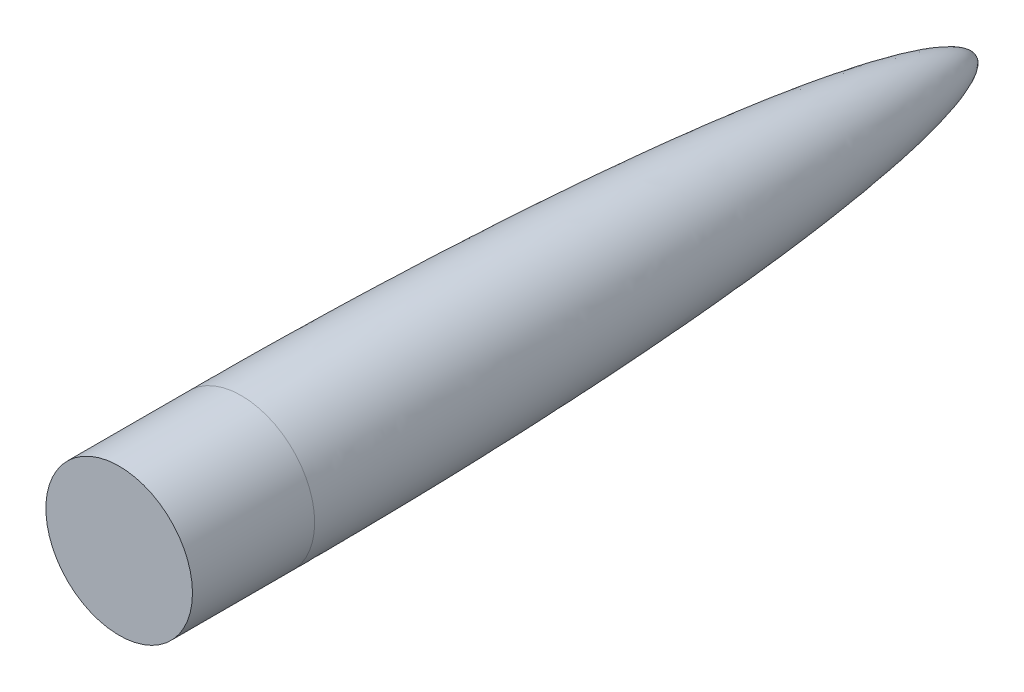
ISO-10303-21;
HEADER;
FILE_DESCRIPTION(('STEP AP214'),'2;1');
FILE_NAME('part.step','',(''),(''),'','','');
FILE_SCHEMA(('AUTOMOTIVE_DESIGN { 1 0 10303 214 1 1 1 1 }'));
ENDSEC;
DATA;
#1=APPLICATION_CONTEXT('core data for automotive mechanical design processes');
#2=APPLICATION_PROTOCOL_DEFINITION('international standard','automotive_design',2000,#1);
#3=PRODUCT_CONTEXT('',#1,'mechanical');
#4=PRODUCT('Part','Part','',(#3));
#5=PRODUCT_RELATED_PRODUCT_CATEGORY('part','',(#4));
#6=PRODUCT_DEFINITION_FORMATION('','',#4);
#7=PRODUCT_DEFINITION_CONTEXT('part definition',#1,'design');
#8=PRODUCT_DEFINITION('design','',#6,#7);
#9=PRODUCT_DEFINITION_SHAPE('','',#8);
#10=(LENGTH_UNIT() NAMED_UNIT(*) SI_UNIT(.MILLI.,.METRE.));
#11=(NAMED_UNIT(*) PLANE_ANGLE_UNIT() SI_UNIT($,.RADIAN.));
#12=(NAMED_UNIT(*) SI_UNIT($,.STERADIAN.) SOLID_ANGLE_UNIT());
#13=UNCERTAINTY_MEASURE_WITH_UNIT(LENGTH_MEASURE(1.E-05),#10,'distance_accuracy_value','');
#14=(GEOMETRIC_REPRESENTATION_CONTEXT(3) GLOBAL_UNCERTAINTY_ASSIGNED_CONTEXT((#13)) GLOBAL_UNIT_ASSIGNED_CONTEXT((#10,
#11,#12)) REPRESENTATION_CONTEXT('',''));
#15=CARTESIAN_POINT('',(0.,0.,0.));
#16=DIRECTION('',(0.,0.,1.));
#17=DIRECTION('',(1.,0.,0.));
#18=AXIS2_PLACEMENT_3D('',#15,#16,#17);
#19=CARTESIAN_POINT('',(0.,0.,127.));
#20=DIRECTION('',(0.,0.,-1.));
#21=DIRECTION('',(-1.,0.,0.));
#22=AXIS2_PLACEMENT_3D('',#19,#20,#21);
#23=CYLINDRICAL_SURFACE('',#22,76.2);
#24=CARTESIAN_POINT('',(0.,0.,127.));
#25=DIRECTION('',(0.,0.,1.));
#26=DIRECTION('',(1.,0.,0.));
#27=AXIS2_PLACEMENT_3D('',#24,#25,#26);
#28=CIRCLE('',#27,76.2);
#29=CARTESIAN_POINT('',(76.2,0.,127.));
#30=VERTEX_POINT('',#29);
#31=EDGE_CURVE('E11',#30,#30,#28,.T.);
#32=ORIENTED_EDGE('',*,*,#31,.F.);
#33=EDGE_LOOP('',(#32));
#34=FACE_BOUND('',#33,.T.);
#35=CARTESIAN_POINT('',(0.,0.,0.));
#36=DIRECTION('',(0.,0.,1.));
#37=DIRECTION('',(1.,0.,0.));
#38=AXIS2_PLACEMENT_3D('',#35,#36,#37);
#39=CIRCLE('',#38,76.2);
#40=CARTESIAN_POINT('',(76.2,0.,0.));
#41=VERTEX_POINT('',#40);
#42=EDGE_CURVE('E50',#41,#41,#39,.T.);
#43=ORIENTED_EDGE('',*,*,#42,.T.);
#44=EDGE_LOOP('',(#43));
#45=FACE_BOUND('',#44,.T.);
#46=ADVANCED_FACE('F39',(#34,#45),#23,.T.);
#47=CARTESIAN_POINT('',(0.,0.,127.));
#48=DIRECTION('',(0.,0.,1.));
#49=DIRECTION('',(1.,0.,0.));
#50=AXIS2_PLACEMENT_3D('',#47,#48,#49);
#51=PLANE('',#50);
#52=ORIENTED_EDGE('',*,*,#31,.T.);
#53=EDGE_LOOP('',(#52));
#54=FACE_BOUND('',#53,.T.);
#55=ADVANCED_FACE('F55',(#54),#51,.T.);
#56=CARTESIAN_POINT('',(0.,0.,-762.));
#57=CARTESIAN_POINT('',(0.,0.486576307109411,-761.999412940227));
#58=CARTESIAN_POINT('',(0.,1.14846036748612,-761.943391779038));
#59=CARTESIAN_POINT('',(0.,2.01477435115242,-761.767441531751));
#60=CARTESIAN_POINT('',(0.,3.14669217771254,-761.371516483082));
#61=CARTESIAN_POINT('',(0.,4.09594230811432,-760.927979401583));
#62=CARTESIAN_POINT('',(0.,5.20328694406654,-760.260109141381));
#63=CARTESIAN_POINT('',(0.,6.50167925000615,-759.271379797162));
#64=CARTESIAN_POINT('',(0.,8.03223258741555,-757.830468181328));
#65=CARTESIAN_POINT('',(0.,9.94012125767027,-755.60935351043));
#66=CARTESIAN_POINT('',(0.,12.4342727581284,-752.002079812972));
#67=CARTESIAN_POINT('',(0.,15.8394192474952,-745.772601329123));
#68=CARTESIAN_POINT('',(0.,19.4950240559308,-737.112527419109));
#69=CARTESIAN_POINT('',(0.,23.1564940016857,-726.400675577437));
#70=CARTESIAN_POINT('',(0.,26.5369810514891,-714.615330257593));
#71=CARTESIAN_POINT('',(0.,29.4224539407738,-703.156611322784));
#72=CARTESIAN_POINT('',(0.,32.5948137892384,-689.135822315339));
#73=CARTESIAN_POINT('',(0.,36.2991105751397,-670.645230154531));
#74=CARTESIAN_POINT('',(0.,40.3334212477934,-647.387926465431));
#75=CARTESIAN_POINT('',(0.,45.6278931859708,-611.862125806289));
#76=CARTESIAN_POINT('',(0.,51.1756333770142,-566.790800708857));
#77=CARTESIAN_POINT('',(0.,56.4893928108532,-514.079621006663));
#78=CARTESIAN_POINT('',(0.,61.4081542475398,-453.734719278005));
#79=CARTESIAN_POINT('',(0.,65.4219334448524,-393.324055345825));
#80=CARTESIAN_POINT('',(0.,68.2740910464225,-340.425271329381));
#81=CARTESIAN_POINT('',(0.,70.3105648451017,-295.064010425315));
#82=CARTESIAN_POINT('',(0.,71.6115838045062,-261.033679036971));
#83=CARTESIAN_POINT('',(0.,72.3892794678055,-238.343835210581));
#84=CARTESIAN_POINT('',(0.,72.9792224135485,-219.433291243113));
#85=CARTESIAN_POINT('',(0.,73.4170732137365,-204.304699792635));
#86=CARTESIAN_POINT('',(0.,73.821317355376,-189.17338818602));
#87=CARTESIAN_POINT('',(0.,74.192565633316,-174.044415613265));
#88=CARTESIAN_POINT('',(0.,74.5312596414046,-158.909284971795));
#89=CARTESIAN_POINT('',(0.,74.8378621623494,-143.782440946102));
#90=CARTESIAN_POINT('',(0.,75.1127438124663,-128.6401710294));
#91=CARTESIAN_POINT('',(0.,75.356256888803,-113.521785182789));
#92=CARTESIAN_POINT('',(0.,75.5686941018409,-98.3626675193425));
#93=CARTESIAN_POINT('',(0.,75.750316982571,-83.2697590859336));
#94=CARTESIAN_POINT('',(0.,75.9013412609585,-68.0650995756323));
#95=CARTESIAN_POINT('',(0.,76.021948219371,-53.0526496092298));
#96=CARTESIAN_POINT('',(0.,76.1009880099351,-39.5982921165378));
#97=CARTESIAN_POINT('',(0.,76.1458065332407,-29.5225373517585));
#98=CARTESIAN_POINT('',(0.,76.1696177789305,-21.4787564262432));
#99=CARTESIAN_POINT('',(0.,76.1884130118562,-14.8923652029691));
#100=CARTESIAN_POINT('',(0.,76.1968683802722,-7.70764496945451));
#101=CARTESIAN_POINT('',(0.,76.2,-3.44481810376425));
#102=CARTESIAN_POINT('',(0.,76.2,1.75122066487325E-12));
#103=B_SPLINE_CURVE_WITH_KNOTS('',4,(#56,#57,#58,#59,#60,#61,#62,#63,#64,#65,#66,#67,#68,#69,
#70,#71,#72,#73,#74,#75,#76,#77,#78,#79,#80,#81,#82,#83,#84,#85,#86,#87,#88,#89,#90,#91,#92,#93,
#94,#95,#96,#97,#98,#99,#100,#101,#102),.UNSPECIFIED.,.F.,.F.,(5,1,1,1,1,1,1,1,1,1,1,1,1,1,1,1,
1,1,1,1,1,1,1,1,1,1,1,1,1,1,1,1,1,1,1,1,1,1,1,1,1,1,1,5),(0.0896076229469628,0.0918856411277133,
0.0927330627079034,0.0937459954444654,0.0952398273480794,0.096804796900895,0.0988037856545656,
0.101408887263899,0.105109747281285,0.11055300496417,0.119396435588473,0.134746369877066,
0.149260393672843,0.163774417468621,0.177048680278385,0.190322943088149,0.216871468707676,
0.252468216766954,0.288064964826232,0.359258466301916,0.430451968988152,0.501645472515109,
0.572838976236299,0.644032479950333,0.679629231799613,0.715225983648894,0.733024359701435,
0.750822735753976,0.768621111806517,0.786419487859059,0.804217863886216,0.822016239913374,
0.839814615940532,0.85761299196769,0.875411367966627,0.893209743965564,0.911008119964501,
0.928806495963438,0.946604871972579,0.964403247981719,0.973302435986289,0.977752029988574,
0.98220162399086,1.),.UNSPECIFIED.);
#104=CARTESIAN_POINT('',(0.,0.,-480.060000000396));
#105=DIRECTION('',(0.,0.,-1.));
#106=AXIS1_PLACEMENT('',#104,#105);
#107=SURFACE_OF_REVOLUTION('',#103,#106);
#108=ORIENTED_EDGE('',*,*,#42,.F.);
#109=EDGE_LOOP('',(#108));
#110=FACE_BOUND('',#109,.T.);
#111=CARTESIAN_POINT('',(0.,0.,-762.));
#112=VERTEX_POINT('',#111);
#113=VERTEX_LOOP('',#112);
#114=FACE_BOUND('',#113,.T.);
#115=ADVANCED_FACE('F41',(#110,#114),#107,.F.);
#116=CLOSED_SHELL('',(#46,#55,#115));
#117=MANIFOLD_SOLID_BREP('B2',#116);
#118=ADVANCED_BREP_SHAPE_REPRESENTATION('',(#18,#117),#14);
#119=SHAPE_DEFINITION_REPRESENTATION(#9,#118);
ENDSEC;
END-ISO-10303-21;
